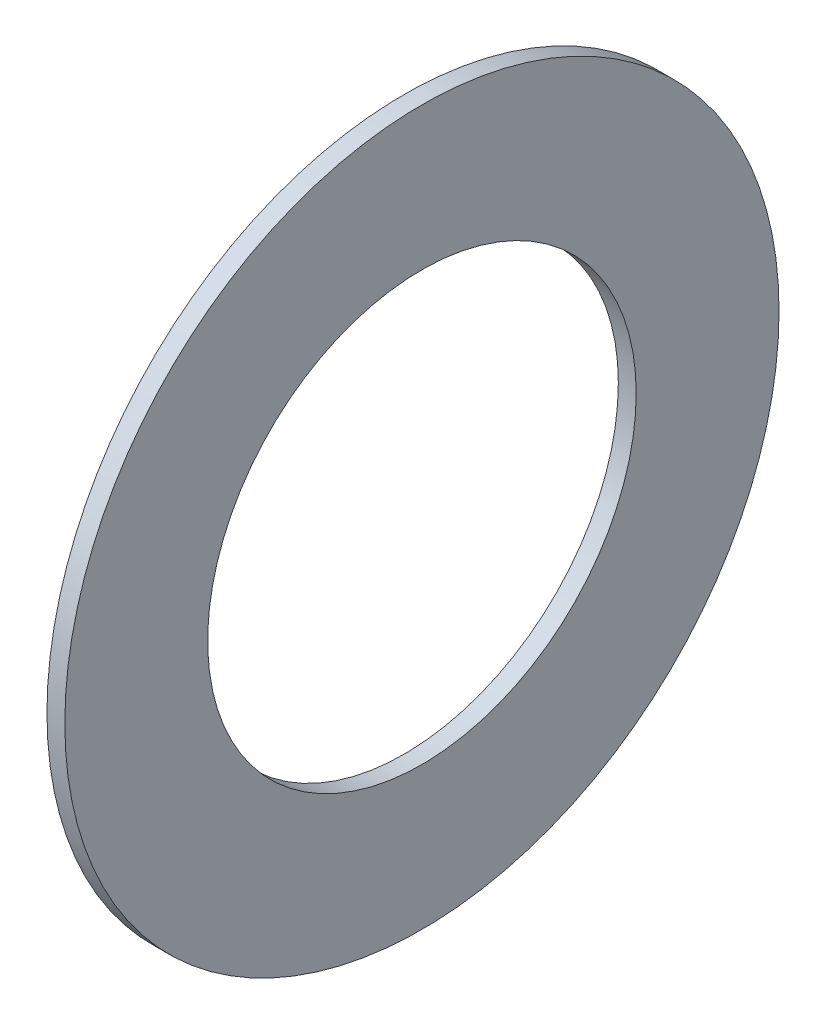
ISO-10303-21;
HEADER;
FILE_DESCRIPTION(('STEP AP214'),'2;1');
FILE_NAME('part.step','',(''),(''),'','','');
FILE_SCHEMA(('AUTOMOTIVE_DESIGN { 1 0 10303 214 1 1 1 1 }'));
ENDSEC;
DATA;
#1=APPLICATION_CONTEXT('core data for automotive mechanical design processes');
#2=APPLICATION_PROTOCOL_DEFINITION('international standard','automotive_design',2000,#1);
#3=PRODUCT_CONTEXT('',#1,'mechanical');
#4=PRODUCT('Part','Part','',(#3));
#5=PRODUCT_RELATED_PRODUCT_CATEGORY('part','',(#4));
#6=PRODUCT_DEFINITION_FORMATION('','',#4);
#7=PRODUCT_DEFINITION_CONTEXT('part definition',#1,'design');
#8=PRODUCT_DEFINITION('design','',#6,#7);
#9=PRODUCT_DEFINITION_SHAPE('','',#8);
#10=(LENGTH_UNIT() NAMED_UNIT(*) SI_UNIT(.MILLI.,.METRE.));
#11=(NAMED_UNIT(*) PLANE_ANGLE_UNIT() SI_UNIT($,.RADIAN.));
#12=(NAMED_UNIT(*) SI_UNIT($,.STERADIAN.) SOLID_ANGLE_UNIT());
#13=UNCERTAINTY_MEASURE_WITH_UNIT(LENGTH_MEASURE(1.E-05),#10,'distance_accuracy_value','');
#14=(GEOMETRIC_REPRESENTATION_CONTEXT(3) GLOBAL_UNCERTAINTY_ASSIGNED_CONTEXT((#13)) GLOBAL_UNIT_ASSIGNED_CONTEXT((#10,
#11,#12)) REPRESENTATION_CONTEXT('',''));
#15=CARTESIAN_POINT('',(0.,0.,0.));
#16=DIRECTION('',(0.,0.,1.));
#17=DIRECTION('',(1.,0.,0.));
#18=AXIS2_PLACEMENT_3D('',#15,#16,#17);
#19=CARTESIAN_POINT('',(0.79375,0.,0.));
#20=DIRECTION('',(1.,0.,0.));
#21=DIRECTION('',(0.,0.,-1.));
#22=AXIS2_PLACEMENT_3D('',#19,#20,#21);
#23=PLANE('',#22);
#24=CARTESIAN_POINT('',(0.79375,0.,0.));
#25=DIRECTION('',(1.,0.,0.));
#26=DIRECTION('',(0.,0.,-1.));
#27=AXIS2_PLACEMENT_3D('',#24,#25,#26);
#28=CIRCLE('',#27,15.875);
#29=CARTESIAN_POINT('',(0.79375,0.,-15.875));
#30=VERTEX_POINT('',#29);
#31=EDGE_CURVE('E10',#30,#30,#28,.T.);
#32=ORIENTED_EDGE('',*,*,#31,.T.);
#33=EDGE_LOOP('',(#32));
#34=FACE_BOUND('',#33,.T.);
#35=CARTESIAN_POINT('',(0.79375,0.,0.));
#36=DIRECTION('',(1.,0.,0.));
#37=DIRECTION('',(0.,0.,-1.));
#38=AXIS2_PLACEMENT_3D('',#35,#36,#37);
#39=CIRCLE('',#38,9.525);
#40=CARTESIAN_POINT('',(0.79375,0.,-9.525));
#41=VERTEX_POINT('',#40);
#42=EDGE_CURVE('E41',#41,#41,#39,.T.);
#43=ORIENTED_EDGE('',*,*,#42,.F.);
#44=EDGE_LOOP('',(#43));
#45=FACE_BOUND('',#44,.T.);
#46=ADVANCED_FACE('F30',(#34,#45),#23,.T.);
#47=CARTESIAN_POINT('',(0.,0.,0.));
#48=DIRECTION('',(1.,0.,0.));
#49=DIRECTION('',(0.,0.,-1.));
#50=AXIS2_PLACEMENT_3D('',#47,#48,#49);
#51=PLANE('',#50);
#52=CARTESIAN_POINT('',(0.,0.,0.));
#53=DIRECTION('',(1.,0.,0.));
#54=DIRECTION('',(0.,0.,-1.));
#55=AXIS2_PLACEMENT_3D('',#52,#53,#54);
#56=CIRCLE('',#55,15.875);
#57=CARTESIAN_POINT('',(0.,0.,-15.875));
#58=VERTEX_POINT('',#57);
#59=EDGE_CURVE('E34',#58,#58,#56,.T.);
#60=ORIENTED_EDGE('',*,*,#59,.F.);
#61=EDGE_LOOP('',(#60));
#62=FACE_BOUND('',#61,.T.);
#63=CARTESIAN_POINT('',(0.,0.,0.));
#64=DIRECTION('',(1.,0.,0.));
#65=DIRECTION('',(0.,0.,-1.));
#66=AXIS2_PLACEMENT_3D('',#63,#64,#65);
#67=CIRCLE('',#66,9.525);
#68=CARTESIAN_POINT('',(0.,0.,-9.525));
#69=VERTEX_POINT('',#68);
#70=EDGE_CURVE('E43',#69,#69,#67,.T.);
#71=ORIENTED_EDGE('',*,*,#70,.T.);
#72=EDGE_LOOP('',(#71));
#73=FACE_BOUND('',#72,.T.);
#74=ADVANCED_FACE('F53',(#62,#73),#51,.F.);
#75=CARTESIAN_POINT('',(0.79375,0.,0.));
#76=DIRECTION('',(-1.,0.,0.));
#77=DIRECTION('',(0.,0.,1.));
#78=AXIS2_PLACEMENT_3D('',#75,#76,#77);
#79=CYLINDRICAL_SURFACE('',#78,15.875);
#80=ORIENTED_EDGE('',*,*,#31,.F.);
#81=EDGE_LOOP('',(#80));
#82=FACE_BOUND('',#81,.T.);
#83=ORIENTED_EDGE('',*,*,#59,.T.);
#84=EDGE_LOOP('',(#83));
#85=FACE_BOUND('',#84,.T.);
#86=ADVANCED_FACE('F32',(#82,#85),#79,.T.);
#87=CARTESIAN_POINT('',(0.79375,0.,0.));
#88=DIRECTION('',(-1.,0.,0.));
#89=DIRECTION('',(0.,0.,1.));
#90=AXIS2_PLACEMENT_3D('',#87,#88,#89);
#91=CYLINDRICAL_SURFACE('',#90,9.525);
#92=ORIENTED_EDGE('',*,*,#42,.T.);
#93=EDGE_LOOP('',(#92));
#94=FACE_BOUND('',#93,.T.);
#95=ORIENTED_EDGE('',*,*,#70,.F.);
#96=EDGE_LOOP('',(#95));
#97=FACE_BOUND('',#96,.T.);
#98=ADVANCED_FACE('F49',(#94,#97),#91,.F.);
#99=CLOSED_SHELL('',(#46,#74,#86,#98));
#100=MANIFOLD_SOLID_BREP('B2',#99);
#101=ADVANCED_BREP_SHAPE_REPRESENTATION('',(#18,#100),#14);
#102=SHAPE_DEFINITION_REPRESENTATION(#9,#101);
ENDSEC;
END-ISO-10303-21;
